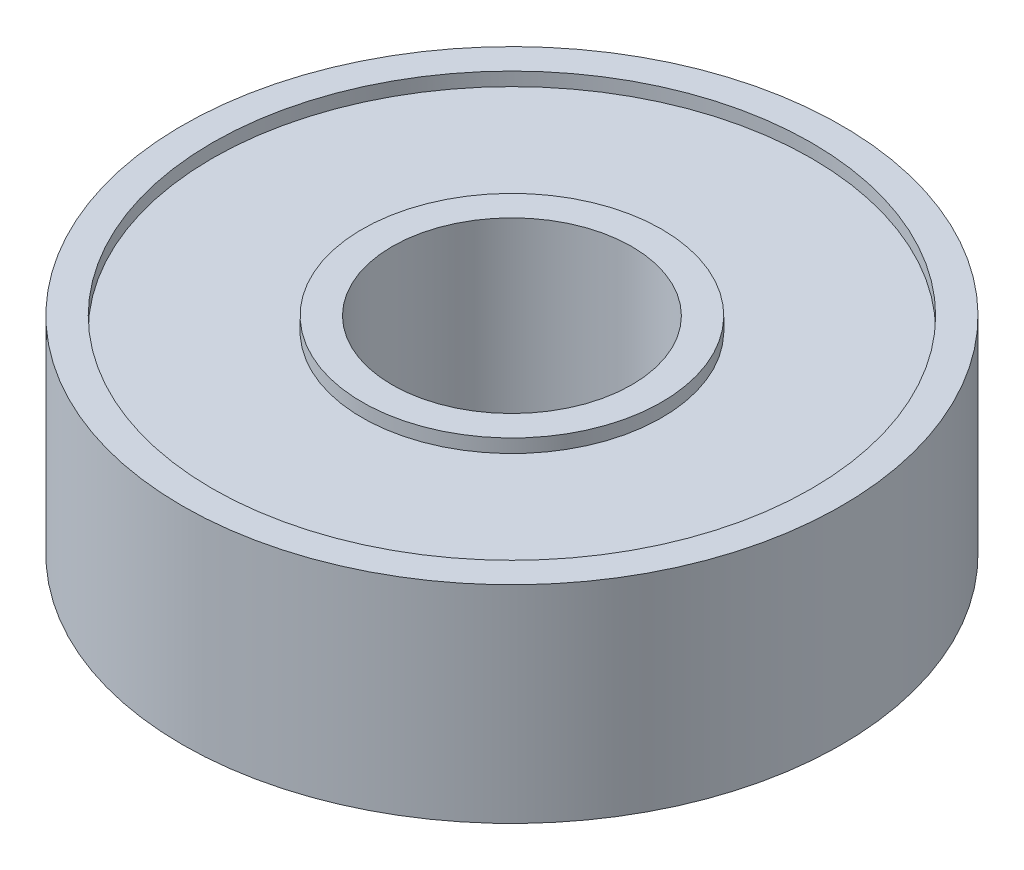
ISO-10303-21;
HEADER;
FILE_DESCRIPTION(('STEP AP214'),'2;1');
FILE_NAME('part.step','',(''),(''),'','','');
FILE_SCHEMA(('AUTOMOTIVE_DESIGN { 1 0 10303 214 1 1 1 1 }'));
ENDSEC;
DATA;
#1=APPLICATION_CONTEXT('core data for automotive mechanical design processes');
#2=APPLICATION_PROTOCOL_DEFINITION('international standard','automotive_design',2000,#1);
#3=PRODUCT_CONTEXT('',#1,'mechanical');
#4=PRODUCT('Part','Part','',(#3));
#5=PRODUCT_RELATED_PRODUCT_CATEGORY('part','',(#4));
#6=PRODUCT_DEFINITION_FORMATION('','',#4);
#7=PRODUCT_DEFINITION_CONTEXT('part definition',#1,'design');
#8=PRODUCT_DEFINITION('design','',#6,#7);
#9=PRODUCT_DEFINITION_SHAPE('','',#8);
#10=(LENGTH_UNIT() NAMED_UNIT(*) SI_UNIT(.MILLI.,.METRE.));
#11=(NAMED_UNIT(*) PLANE_ANGLE_UNIT() SI_UNIT($,.RADIAN.));
#12=(NAMED_UNIT(*) SI_UNIT($,.STERADIAN.) SOLID_ANGLE_UNIT());
#13=UNCERTAINTY_MEASURE_WITH_UNIT(LENGTH_MEASURE(1.E-05),#10,'distance_accuracy_value','');
#14=(GEOMETRIC_REPRESENTATION_CONTEXT(3) GLOBAL_UNCERTAINTY_ASSIGNED_CONTEXT((#13)) GLOBAL_UNIT_ASSIGNED_CONTEXT((#10,
#11,#12)) REPRESENTATION_CONTEXT('',''));
#15=CARTESIAN_POINT('',(0.,0.,0.));
#16=DIRECTION('',(0.,0.,1.));
#17=DIRECTION('',(1.,0.,0.));
#18=AXIS2_PLACEMENT_3D('',#15,#16,#17);
#19=CARTESIAN_POINT('',(0.,3.,0.));
#20=DIRECTION('',(0.,1.,0.));
#21=DIRECTION('',(0.,0.,1.));
#22=AXIS2_PLACEMENT_3D('',#19,#20,#21);
#23=PLANE('',#22);
#24=CARTESIAN_POINT('',(0.,3.,0.));
#25=DIRECTION('',(0.,1.,0.));
#26=DIRECTION('',(0.,0.,1.));
#27=AXIS2_PLACEMENT_3D('',#24,#25,#26);
#28=CIRCLE('',#27,10.);
#29=CARTESIAN_POINT('',(0.,3.,-10.));
#30=VERTEX_POINT('',#29);
#31=EDGE_CURVE('E40',#30,#30,#28,.F.);
#32=ORIENTED_EDGE('',*,*,#31,.F.);
#33=EDGE_LOOP('',(#32));
#34=FACE_BOUND('',#33,.T.);
#35=CARTESIAN_POINT('',(0.,3.,0.));
#36=DIRECTION('',(0.,1.,0.));
#37=DIRECTION('',(0.,0.,1.));
#38=AXIS2_PLACEMENT_3D('',#35,#36,#37);
#39=CIRCLE('',#38,5.);
#40=CARTESIAN_POINT('',(0.,3.,-5.));
#41=VERTEX_POINT('',#40);
#42=EDGE_CURVE('E60',#41,#41,#39,.F.);
#43=ORIENTED_EDGE('',*,*,#42,.T.);
#44=EDGE_LOOP('',(#43));
#45=FACE_BOUND('',#44,.T.);
#46=ADVANCED_FACE('F33',(#34,#45),#23,.T.);
#47=CARTESIAN_POINT('',(0.,-3.,0.));
#48=DIRECTION('',(0.,1.,0.));
#49=DIRECTION('',(0.,0.,1.));
#50=AXIS2_PLACEMENT_3D('',#47,#48,#49);
#51=PLANE('',#50);
#52=CARTESIAN_POINT('',(0.,-3.,0.));
#53=DIRECTION('',(0.,1.,0.));
#54=DIRECTION('',(0.,0.,1.));
#55=AXIS2_PLACEMENT_3D('',#52,#53,#54);
#56=CIRCLE('',#55,10.);
#57=CARTESIAN_POINT('',(0.,-3.,-10.));
#58=VERTEX_POINT('',#57);
#59=EDGE_CURVE('E44',#58,#58,#56,.F.);
#60=ORIENTED_EDGE('',*,*,#59,.T.);
#61=EDGE_LOOP('',(#60));
#62=FACE_BOUND('',#61,.T.);
#63=CARTESIAN_POINT('',(0.,-3.,0.));
#64=DIRECTION('',(0.,1.,0.));
#65=DIRECTION('',(0.,0.,1.));
#66=AXIS2_PLACEMENT_3D('',#63,#64,#65);
#67=CIRCLE('',#66,5.);
#68=CARTESIAN_POINT('',(0.,-3.,-5.));
#69=VERTEX_POINT('',#68);
#70=EDGE_CURVE('E10',#69,#69,#67,.F.);
#71=ORIENTED_EDGE('',*,*,#70,.F.);
#72=EDGE_LOOP('',(#71));
#73=FACE_BOUND('',#72,.T.);
#74=ADVANCED_FACE('F101',(#62,#73),#51,.F.);
#75=CARTESIAN_POINT('',(0.,3.45,0.));
#76=DIRECTION('',(0.,1.,0.));
#77=DIRECTION('',(0.,0.,1.));
#78=AXIS2_PLACEMENT_3D('',#75,#76,#77);
#79=PLANE('',#78);
#80=CARTESIAN_POINT('',(0.,3.45,0.));
#81=DIRECTION('',(0.,1.,0.));
#82=DIRECTION('',(0.,0.,1.));
#83=AXIS2_PLACEMENT_3D('',#80,#81,#82);
#84=CIRCLE('',#83,11.);
#85=CARTESIAN_POINT('',(0.,3.45,11.));
#86=VERTEX_POINT('',#85);
#87=EDGE_CURVE('E49',#86,#86,#84,.T.);
#88=ORIENTED_EDGE('',*,*,#87,.T.);
#89=EDGE_LOOP('',(#88));
#90=FACE_BOUND('',#89,.T.);
#91=CARTESIAN_POINT('',(0.,3.45,0.));
#92=DIRECTION('',(0.,1.,0.));
#93=DIRECTION('',(0.,0.,1.));
#94=AXIS2_PLACEMENT_3D('',#91,#92,#93);
#95=CIRCLE('',#94,10.);
#96=CARTESIAN_POINT('',(0.,3.45,-10.));
#97=VERTEX_POINT('',#96);
#98=EDGE_CURVE('E54',#97,#97,#95,.T.);
#99=ORIENTED_EDGE('',*,*,#98,.F.);
#100=EDGE_LOOP('',(#99));
#101=FACE_BOUND('',#100,.T.);
#102=ADVANCED_FACE('F107',(#90,#101),#79,.T.);
#103=CARTESIAN_POINT('',(0.,3.45,0.));
#104=DIRECTION('',(0.,-1.,0.));
#105=DIRECTION('',(0.,0.,-1.));
#106=AXIS2_PLACEMENT_3D('',#103,#104,#105);
#107=CYLINDRICAL_SURFACE('',#106,10.);
#108=CARTESIAN_POINT('',(0.,3.,-10.));
#109=CARTESIAN_POINT('',(0.,3.0046875,-10.));
#110=CARTESIAN_POINT('',(0.,3.009375,-10.));
#111=CARTESIAN_POINT('',(0.,3.01875,-10.));
#112=CARTESIAN_POINT('',(0.,3.0234375,-10.));
#113=CARTESIAN_POINT('',(0.,3.0328125,-10.));
#114=CARTESIAN_POINT('',(0.,3.0375,-10.));
#115=CARTESIAN_POINT('',(0.,3.046875,-10.));
#116=CARTESIAN_POINT('',(0.,3.0515625,-10.));
#117=CARTESIAN_POINT('',(0.,3.0609375,-10.));
#118=CARTESIAN_POINT('',(0.,3.065625,-10.));
#119=CARTESIAN_POINT('',(0.,3.075,-10.));
#120=CARTESIAN_POINT('',(0.,3.0796875,-10.));
#121=CARTESIAN_POINT('',(0.,3.0890625,-10.));
#122=CARTESIAN_POINT('',(0.,3.09375,-10.));
#123=CARTESIAN_POINT('',(0.,3.103125,-10.));
#124=CARTESIAN_POINT('',(0.,3.1078125,-10.));
#125=CARTESIAN_POINT('',(0.,3.1171875,-10.));
#126=CARTESIAN_POINT('',(0.,3.121875,-10.));
#127=CARTESIAN_POINT('',(0.,3.13125,-10.));
#128=CARTESIAN_POINT('',(0.,3.1359375,-10.));
#129=CARTESIAN_POINT('',(0.,3.1453125,-10.));
#130=CARTESIAN_POINT('',(0.,3.15,-10.));
#131=CARTESIAN_POINT('',(0.,3.159375,-10.));
#132=CARTESIAN_POINT('',(0.,3.1640625,-10.));
#133=CARTESIAN_POINT('',(0.,3.1734375,-10.));
#134=CARTESIAN_POINT('',(0.,3.178125,-10.));
#135=CARTESIAN_POINT('',(0.,3.1875,-10.));
#136=CARTESIAN_POINT('',(0.,3.1921875,-10.));
#137=CARTESIAN_POINT('',(0.,3.2015625,-10.));
#138=CARTESIAN_POINT('',(0.,3.20625,-10.));
#139=CARTESIAN_POINT('',(0.,3.215625,-10.));
#140=CARTESIAN_POINT('',(0.,3.2203125,-10.));
#141=CARTESIAN_POINT('',(0.,3.2296875,-10.));
#142=CARTESIAN_POINT('',(0.,3.234375,-10.));
#143=CARTESIAN_POINT('',(0.,3.24375,-10.));
#144=CARTESIAN_POINT('',(0.,3.2484375,-10.));
#145=CARTESIAN_POINT('',(0.,3.2578125,-10.));
#146=CARTESIAN_POINT('',(0.,3.2625,-10.));
#147=CARTESIAN_POINT('',(0.,3.271875,-10.));
#148=CARTESIAN_POINT('',(0.,3.2765625,-10.));
#149=CARTESIAN_POINT('',(0.,3.2859375,-10.));
#150=CARTESIAN_POINT('',(0.,3.290625,-10.));
#151=CARTESIAN_POINT('',(0.,3.3,-10.));
#152=CARTESIAN_POINT('',(0.,3.3046875,-10.));
#153=CARTESIAN_POINT('',(0.,3.3140625,-10.));
#154=CARTESIAN_POINT('',(0.,3.31875,-10.));
#155=CARTESIAN_POINT('',(0.,3.328125,-10.));
#156=CARTESIAN_POINT('',(0.,3.3328125,-10.));
#157=CARTESIAN_POINT('',(0.,3.3421875,-10.));
#158=CARTESIAN_POINT('',(0.,3.346875,-10.));
#159=CARTESIAN_POINT('',(0.,3.35625,-10.));
#160=CARTESIAN_POINT('',(0.,3.3609375,-10.));
#161=CARTESIAN_POINT('',(0.,3.3703125,-10.));
#162=CARTESIAN_POINT('',(0.,3.375,-10.));
#163=CARTESIAN_POINT('',(0.,3.384375,-10.));
#164=CARTESIAN_POINT('',(0.,3.3890625,-10.));
#165=CARTESIAN_POINT('',(0.,3.3984375,-10.));
#166=CARTESIAN_POINT('',(0.,3.403125,-10.));
#167=CARTESIAN_POINT('',(0.,3.4125,-10.));
#168=CARTESIAN_POINT('',(0.,3.4171875,-10.));
#169=CARTESIAN_POINT('',(0.,3.4265625,-10.));
#170=CARTESIAN_POINT('',(0.,3.43125,-10.));
#171=CARTESIAN_POINT('',(0.,3.440625,-10.));
#172=CARTESIAN_POINT('',(0.,3.4453125,-10.));
#173=CARTESIAN_POINT('',(0.,3.45,-10.));
#174=B_SPLINE_CURVE_WITH_KNOTS('',3,(#108,#109,#110,#111,#112,#113,#114,#115,#116,#117,#118,
#119,#120,#121,#122,#123,#124,#125,#126,#127,#128,#129,#130,#131,#132,#133,#134,#135,#136,#137,
#138,#139,#140,#141,#142,#143,#144,#145,#146,#147,#148,#149,#150,#151,#152,#153,#154,#155,#156,
#157,#158,#159,#160,#161,#162,#163,#164,#165,#166,#167,#168,#169,#170,#171,#172,#173),
.UNSPECIFIED.,.F.,.F.,(4,2,2,2,2,2,2,2,2,2,2,2,2,2,2,2,2,2,2,2,2,2,2,2,2,2,2,2,2,2,2,2,4),(0.,
0.0140625000000002,0.0281250000000004,0.0421875000000001,0.0562500000000003,0.0703125000000001,
0.0843750000000003,0.0984375000000004,0.1125,0.1265625,0.140625,0.1546875,0.168750000000001,
0.1828125,0.196875,0.2109375,0.225,0.239062500000001,0.253125,0.267187500000001,0.28125,
0.2953125,0.309375000000001,0.3234375,0.337500000000001,0.3515625,0.365625,0.379687500000001,
0.39375,0.407812500000001,0.421875,0.435937500000001,0.450000000000001),.UNSPECIFIED.);
#175=EDGE_CURVE('BSEAM117',#30,#97,#174,.T.);
#176=ORIENTED_EDGE('',*,*,#31,.T.);
#177=ORIENTED_EDGE('',*,*,#98,.T.);
#178=ORIENTED_EDGE('',*,*,#175,.T.);
#179=ORIENTED_EDGE('',*,*,#175,.F.);
#180=EDGE_LOOP('',(#176,#178,#177,#179));
#181=FACE_BOUND('',#180,.T.);
#182=ADVANCED_FACE('F117',(#181),#107,.F.);
#183=CARTESIAN_POINT('',(0.,3.,0.));
#184=DIRECTION('',(0.,-1.,0.));
#185=DIRECTION('',(0.,0.,-1.));
#186=AXIS2_PLACEMENT_3D('',#183,#184,#185);
#187=CYLINDRICAL_SURFACE('',#186,11.);
#188=CARTESIAN_POINT('',(0.,-3.45,0.));
#189=DIRECTION('',(0.,1.,0.));
#190=DIRECTION('',(0.,0.,1.));
#191=AXIS2_PLACEMENT_3D('',#188,#189,#190);
#192=CIRCLE('',#191,11.);
#193=CARTESIAN_POINT('',(0.,-3.45,11.));
#194=VERTEX_POINT('',#193);
#195=EDGE_CURVE('E51',#194,#194,#192,.T.);
#196=ORIENTED_EDGE('',*,*,#195,.T.);
#197=EDGE_LOOP('',(#196));
#198=FACE_BOUND('',#197,.T.);
#199=ORIENTED_EDGE('',*,*,#87,.F.);
#200=EDGE_LOOP('',(#199));
#201=FACE_BOUND('',#200,.T.);
#202=ADVANCED_FACE('F35',(#198,#201),#187,.T.);
#203=CARTESIAN_POINT('',(0.,-3.45,0.));
#204=DIRECTION('',(0.,1.,0.));
#205=DIRECTION('',(0.,0.,1.));
#206=AXIS2_PLACEMENT_3D('',#203,#204,#205);
#207=PLANE('',#206);
#208=ORIENTED_EDGE('',*,*,#195,.F.);
#209=EDGE_LOOP('',(#208));
#210=FACE_BOUND('',#209,.T.);
#211=CARTESIAN_POINT('',(0.,-3.45,0.));
#212=DIRECTION('',(0.,1.,0.));
#213=DIRECTION('',(0.,0.,1.));
#214=AXIS2_PLACEMENT_3D('',#211,#212,#213);
#215=CIRCLE('',#214,10.);
#216=CARTESIAN_POINT('',(0.,-3.45,-10.));
#217=VERTEX_POINT('',#216);
#218=EDGE_CURVE('E57',#217,#217,#215,.T.);
#219=ORIENTED_EDGE('',*,*,#218,.T.);
#220=EDGE_LOOP('',(#219));
#221=FACE_BOUND('',#220,.T.);
#222=ADVANCED_FACE('F111',(#210,#221),#207,.F.);
#223=CARTESIAN_POINT('',(0.,-3.45,-10.));
#224=CARTESIAN_POINT('',(0.,-3.4453125,-10.));
#225=CARTESIAN_POINT('',(0.,-3.440625,-10.));
#226=CARTESIAN_POINT('',(0.,-3.43125,-10.));
#227=CARTESIAN_POINT('',(0.,-3.4265625,-10.));
#228=CARTESIAN_POINT('',(0.,-3.4171875,-10.));
#229=CARTESIAN_POINT('',(0.,-3.4125,-10.));
#230=CARTESIAN_POINT('',(0.,-3.403125,-10.));
#231=CARTESIAN_POINT('',(0.,-3.3984375,-10.));
#232=CARTESIAN_POINT('',(0.,-3.3890625,-10.));
#233=CARTESIAN_POINT('',(0.,-3.384375,-10.));
#234=CARTESIAN_POINT('',(0.,-3.375,-10.));
#235=CARTESIAN_POINT('',(0.,-3.3703125,-10.));
#236=CARTESIAN_POINT('',(0.,-3.3609375,-10.));
#237=CARTESIAN_POINT('',(0.,-3.35625,-10.));
#238=CARTESIAN_POINT('',(0.,-3.346875,-10.));
#239=CARTESIAN_POINT('',(0.,-3.3421875,-10.));
#240=CARTESIAN_POINT('',(0.,-3.3328125,-10.));
#241=CARTESIAN_POINT('',(0.,-3.328125,-10.));
#242=CARTESIAN_POINT('',(0.,-3.31875,-10.));
#243=CARTESIAN_POINT('',(0.,-3.3140625,-10.));
#244=CARTESIAN_POINT('',(0.,-3.3046875,-10.));
#245=CARTESIAN_POINT('',(0.,-3.3,-10.));
#246=CARTESIAN_POINT('',(0.,-3.290625,-10.));
#247=CARTESIAN_POINT('',(0.,-3.2859375,-10.));
#248=CARTESIAN_POINT('',(0.,-3.2765625,-10.));
#249=CARTESIAN_POINT('',(0.,-3.271875,-10.));
#250=CARTESIAN_POINT('',(0.,-3.2625,-10.));
#251=CARTESIAN_POINT('',(0.,-3.2578125,-10.));
#252=CARTESIAN_POINT('',(0.,-3.2484375,-10.));
#253=CARTESIAN_POINT('',(0.,-3.24375,-10.));
#254=CARTESIAN_POINT('',(0.,-3.234375,-10.));
#255=CARTESIAN_POINT('',(0.,-3.2296875,-10.));
#256=CARTESIAN_POINT('',(0.,-3.2203125,-10.));
#257=CARTESIAN_POINT('',(0.,-3.215625,-10.));
#258=CARTESIAN_POINT('',(0.,-3.20625,-10.));
#259=CARTESIAN_POINT('',(0.,-3.2015625,-10.));
#260=CARTESIAN_POINT('',(0.,-3.1921875,-10.));
#261=CARTESIAN_POINT('',(0.,-3.1875,-10.));
#262=CARTESIAN_POINT('',(0.,-3.178125,-10.));
#263=CARTESIAN_POINT('',(0.,-3.1734375,-10.));
#264=CARTESIAN_POINT('',(0.,-3.1640625,-10.));
#265=CARTESIAN_POINT('',(0.,-3.159375,-10.));
#266=CARTESIAN_POINT('',(0.,-3.15,-10.));
#267=CARTESIAN_POINT('',(0.,-3.1453125,-10.));
#268=CARTESIAN_POINT('',(0.,-3.1359375,-10.));
#269=CARTESIAN_POINT('',(0.,-3.13125,-10.));
#270=CARTESIAN_POINT('',(0.,-3.121875,-10.));
#271=CARTESIAN_POINT('',(0.,-3.1171875,-10.));
#272=CARTESIAN_POINT('',(0.,-3.1078125,-10.));
#273=CARTESIAN_POINT('',(0.,-3.103125,-10.));
#274=CARTESIAN_POINT('',(0.,-3.09375,-10.));
#275=CARTESIAN_POINT('',(0.,-3.0890625,-10.));
#276=CARTESIAN_POINT('',(0.,-3.0796875,-10.));
#277=CARTESIAN_POINT('',(0.,-3.075,-10.));
#278=CARTESIAN_POINT('',(0.,-3.065625,-10.));
#279=CARTESIAN_POINT('',(0.,-3.0609375,-10.));
#280=CARTESIAN_POINT('',(0.,-3.0515625,-10.));
#281=CARTESIAN_POINT('',(0.,-3.046875,-10.));
#282=CARTESIAN_POINT('',(0.,-3.0375,-10.));
#283=CARTESIAN_POINT('',(0.,-3.0328125,-10.));
#284=CARTESIAN_POINT('',(0.,-3.0234375,-10.));
#285=CARTESIAN_POINT('',(0.,-3.01875,-10.));
#286=CARTESIAN_POINT('',(0.,-3.009375,-10.));
#287=CARTESIAN_POINT('',(0.,-3.0046875,-10.));
#288=CARTESIAN_POINT('',(0.,-3.,-10.));
#289=B_SPLINE_CURVE_WITH_KNOTS('',3,(#223,#224,#225,#226,#227,#228,#229,#230,#231,#232,#233,
#234,#235,#236,#237,#238,#239,#240,#241,#242,#243,#244,#245,#246,#247,#248,#249,#250,#251,#252,
#253,#254,#255,#256,#257,#258,#259,#260,#261,#262,#263,#264,#265,#266,#267,#268,#269,#270,#271,
#272,#273,#274,#275,#276,#277,#278,#279,#280,#281,#282,#283,#284,#285,#286,#287,#288),
.UNSPECIFIED.,.F.,.F.,(4,2,2,2,2,2,2,2,2,2,2,2,2,2,2,2,2,2,2,2,2,2,2,2,2,2,2,2,2,2,2,2,4),(0.,
0.0140625000000002,0.0281250000000004,0.0421874999999997,0.0562499999999999,0.0703125000000001,
0.0843749999999994,0.0984374999999996,0.1125,0.1265625,0.140625,0.154687499999999,0.16875,
0.1828125,0.196874999999999,0.210937499999999,0.225,0.2390625,0.253125,0.267187499999999,
0.281249999999999,0.2953125,0.309374999999999,0.323437499999999,0.337499999999999,
0.351562499999999,0.365625,0.379687499999999,0.393749999999999,0.407812499999999,
0.421874999999999,0.435937499999999,0.449999999999999),.UNSPECIFIED.);
#290=EDGE_CURVE('BSEAM114',#217,#58,#289,.T.);
#291=ORIENTED_EDGE('',*,*,#218,.F.);
#292=ORIENTED_EDGE('',*,*,#59,.F.);
#293=ORIENTED_EDGE('',*,*,#290,.T.);
#294=ORIENTED_EDGE('',*,*,#290,.F.);
#295=EDGE_LOOP('',(#291,#293,#292,#294));
#296=FACE_BOUND('',#295,.T.);
#297=ADVANCED_FACE('F114',(#296),#107,.F.);
#298=CARTESIAN_POINT('',(0.,-3.45,0.));
#299=DIRECTION('',(0.,1.,0.));
#300=DIRECTION('',(0.,0.,1.));
#301=AXIS2_PLACEMENT_3D('',#298,#299,#300);
#302=PLANE('',#301);
#303=CARTESIAN_POINT('',(0.,-3.45,0.));
#304=DIRECTION('',(0.,1.,0.));
#305=DIRECTION('',(0.,0.,1.));
#306=AXIS2_PLACEMENT_3D('',#303,#304,#305);
#307=CIRCLE('',#306,4.);
#308=CARTESIAN_POINT('',(0.,-3.45,4.));
#309=VERTEX_POINT('',#308);
#310=EDGE_CURVE('E69',#309,#309,#307,.T.);
#311=ORIENTED_EDGE('',*,*,#310,.T.);
#312=EDGE_LOOP('',(#311));
#313=FACE_BOUND('',#312,.T.);
#314=CARTESIAN_POINT('',(0.,-3.45,0.));
#315=DIRECTION('',(0.,1.,0.));
#316=DIRECTION('',(0.,0.,1.));
#317=AXIS2_PLACEMENT_3D('',#314,#315,#316);
#318=CIRCLE('',#317,5.);
#319=CARTESIAN_POINT('',(0.,-3.45,-5.));
#320=VERTEX_POINT('',#319);
#321=EDGE_CURVE('E66',#320,#320,#318,.T.);
#322=ORIENTED_EDGE('',*,*,#321,.F.);
#323=EDGE_LOOP('',(#322));
#324=FACE_BOUND('',#323,.T.);
#325=ADVANCED_FACE('F95',(#313,#324),#302,.F.);
#326=CARTESIAN_POINT('',(0.,3.45,0.));
#327=DIRECTION('',(0.,-1.,0.));
#328=DIRECTION('',(0.,0.,-1.));
#329=AXIS2_PLACEMENT_3D('',#326,#327,#328);
#330=CYLINDRICAL_SURFACE('',#329,5.);
#331=CARTESIAN_POINT('',(0.,-3.45,-5.));
#332=CARTESIAN_POINT('',(0.,-3.4453125,-5.));
#333=CARTESIAN_POINT('',(0.,-3.440625,-5.));
#334=CARTESIAN_POINT('',(0.,-3.43125,-5.));
#335=CARTESIAN_POINT('',(0.,-3.4265625,-5.));
#336=CARTESIAN_POINT('',(0.,-3.4171875,-5.));
#337=CARTESIAN_POINT('',(0.,-3.4125,-5.));
#338=CARTESIAN_POINT('',(0.,-3.403125,-5.));
#339=CARTESIAN_POINT('',(0.,-3.3984375,-5.));
#340=CARTESIAN_POINT('',(0.,-3.3890625,-5.));
#341=CARTESIAN_POINT('',(0.,-3.384375,-5.));
#342=CARTESIAN_POINT('',(0.,-3.375,-5.));
#343=CARTESIAN_POINT('',(0.,-3.3703125,-5.));
#344=CARTESIAN_POINT('',(0.,-3.3609375,-5.));
#345=CARTESIAN_POINT('',(0.,-3.35625,-5.));
#346=CARTESIAN_POINT('',(0.,-3.346875,-5.));
#347=CARTESIAN_POINT('',(0.,-3.3421875,-5.));
#348=CARTESIAN_POINT('',(0.,-3.3328125,-5.));
#349=CARTESIAN_POINT('',(0.,-3.328125,-5.));
#350=CARTESIAN_POINT('',(0.,-3.31875,-5.));
#351=CARTESIAN_POINT('',(0.,-3.3140625,-5.));
#352=CARTESIAN_POINT('',(0.,-3.3046875,-5.));
#353=CARTESIAN_POINT('',(0.,-3.3,-5.));
#354=CARTESIAN_POINT('',(0.,-3.290625,-5.));
#355=CARTESIAN_POINT('',(0.,-3.2859375,-5.));
#356=CARTESIAN_POINT('',(0.,-3.2765625,-5.));
#357=CARTESIAN_POINT('',(0.,-3.271875,-5.));
#358=CARTESIAN_POINT('',(0.,-3.2625,-5.));
#359=CARTESIAN_POINT('',(0.,-3.2578125,-5.));
#360=CARTESIAN_POINT('',(0.,-3.2484375,-5.));
#361=CARTESIAN_POINT('',(0.,-3.24375,-5.));
#362=CARTESIAN_POINT('',(0.,-3.234375,-5.));
#363=CARTESIAN_POINT('',(0.,-3.2296875,-5.));
#364=CARTESIAN_POINT('',(0.,-3.2203125,-5.));
#365=CARTESIAN_POINT('',(0.,-3.215625,-5.));
#366=CARTESIAN_POINT('',(0.,-3.20625,-5.));
#367=CARTESIAN_POINT('',(0.,-3.2015625,-5.));
#368=CARTESIAN_POINT('',(0.,-3.1921875,-5.));
#369=CARTESIAN_POINT('',(0.,-3.1875,-5.));
#370=CARTESIAN_POINT('',(0.,-3.178125,-5.));
#371=CARTESIAN_POINT('',(0.,-3.1734375,-5.));
#372=CARTESIAN_POINT('',(0.,-3.1640625,-5.));
#373=CARTESIAN_POINT('',(0.,-3.159375,-5.));
#374=CARTESIAN_POINT('',(0.,-3.15,-5.));
#375=CARTESIAN_POINT('',(0.,-3.1453125,-5.));
#376=CARTESIAN_POINT('',(0.,-3.1359375,-5.));
#377=CARTESIAN_POINT('',(0.,-3.13125,-5.));
#378=CARTESIAN_POINT('',(0.,-3.121875,-5.));
#379=CARTESIAN_POINT('',(0.,-3.1171875,-5.));
#380=CARTESIAN_POINT('',(0.,-3.1078125,-5.));
#381=CARTESIAN_POINT('',(0.,-3.103125,-5.));
#382=CARTESIAN_POINT('',(0.,-3.09375,-5.));
#383=CARTESIAN_POINT('',(0.,-3.0890625,-5.));
#384=CARTESIAN_POINT('',(0.,-3.0796875,-5.));
#385=CARTESIAN_POINT('',(0.,-3.075,-5.));
#386=CARTESIAN_POINT('',(0.,-3.065625,-5.));
#387=CARTESIAN_POINT('',(0.,-3.0609375,-5.));
#388=CARTESIAN_POINT('',(0.,-3.0515625,-5.));
#389=CARTESIAN_POINT('',(0.,-3.046875,-5.));
#390=CARTESIAN_POINT('',(0.,-3.0375,-5.));
#391=CARTESIAN_POINT('',(0.,-3.0328125,-5.));
#392=CARTESIAN_POINT('',(0.,-3.0234375,-5.));
#393=CARTESIAN_POINT('',(0.,-3.01875,-5.));
#394=CARTESIAN_POINT('',(0.,-3.009375,-5.));
#395=CARTESIAN_POINT('',(0.,-3.0046875,-5.));
#396=CARTESIAN_POINT('',(0.,-3.,-5.));
#397=B_SPLINE_CURVE_WITH_KNOTS('',3,(#331,#332,#333,#334,#335,#336,#337,#338,#339,#340,#341,
#342,#343,#344,#345,#346,#347,#348,#349,#350,#351,#352,#353,#354,#355,#356,#357,#358,#359,#360,
#361,#362,#363,#364,#365,#366,#367,#368,#369,#370,#371,#372,#373,#374,#375,#376,#377,#378,#379,
#380,#381,#382,#383,#384,#385,#386,#387,#388,#389,#390,#391,#392,#393,#394,#395,#396),
.UNSPECIFIED.,.F.,.F.,(4,2,2,2,2,2,2,2,2,2,2,2,2,2,2,2,2,2,2,2,2,2,2,2,2,2,2,2,2,2,2,2,4),(0.,
0.0140625000000002,0.0281250000000004,0.0421874999999997,0.0562499999999999,0.0703125000000001,
0.0843749999999994,0.0984374999999996,0.1125,0.1265625,0.140625,0.154687499999999,0.16875,
0.1828125,0.196874999999999,0.210937499999999,0.225,0.2390625,0.253125,0.267187499999999,
0.281249999999999,0.2953125,0.309374999999999,0.323437499999999,0.337499999999999,
0.351562499999999,0.365625,0.379687499999999,0.393749999999999,0.407812499999999,
0.421874999999999,0.435937499999999,0.449999999999999),.UNSPECIFIED.);
#398=EDGE_CURVE('BSEAM89',#320,#69,#397,.T.);
#399=ORIENTED_EDGE('',*,*,#321,.T.);
#400=ORIENTED_EDGE('',*,*,#70,.T.);
#401=ORIENTED_EDGE('',*,*,#398,.T.);
#402=ORIENTED_EDGE('',*,*,#398,.F.);
#403=EDGE_LOOP('',(#399,#401,#400,#402));
#404=FACE_BOUND('',#403,.T.);
#405=ADVANCED_FACE('F89',(#404),#330,.T.);
#406=CARTESIAN_POINT('',(0.,3.45,0.));
#407=DIRECTION('',(0.,1.,0.));
#408=DIRECTION('',(0.,0.,1.));
#409=AXIS2_PLACEMENT_3D('',#406,#407,#408);
#410=CIRCLE('',#409,5.);
#411=CARTESIAN_POINT('',(0.,3.45,-5.));
#412=VERTEX_POINT('',#411);
#413=EDGE_CURVE('E65',#412,#412,#410,.T.);
#414=CARTESIAN_POINT('',(0.,3.,-5.));
#415=CARTESIAN_POINT('',(0.,3.0046875,-5.));
#416=CARTESIAN_POINT('',(0.,3.009375,-5.));
#417=CARTESIAN_POINT('',(0.,3.01875,-5.));
#418=CARTESIAN_POINT('',(0.,3.0234375,-5.));
#419=CARTESIAN_POINT('',(0.,3.0328125,-5.));
#420=CARTESIAN_POINT('',(0.,3.0375,-5.));
#421=CARTESIAN_POINT('',(0.,3.046875,-5.));
#422=CARTESIAN_POINT('',(0.,3.0515625,-5.));
#423=CARTESIAN_POINT('',(0.,3.0609375,-5.));
#424=CARTESIAN_POINT('',(0.,3.065625,-5.));
#425=CARTESIAN_POINT('',(0.,3.075,-5.));
#426=CARTESIAN_POINT('',(0.,3.0796875,-5.));
#427=CARTESIAN_POINT('',(0.,3.0890625,-5.));
#428=CARTESIAN_POINT('',(0.,3.09375,-5.));
#429=CARTESIAN_POINT('',(0.,3.103125,-5.));
#430=CARTESIAN_POINT('',(0.,3.1078125,-5.));
#431=CARTESIAN_POINT('',(0.,3.1171875,-5.));
#432=CARTESIAN_POINT('',(0.,3.121875,-5.));
#433=CARTESIAN_POINT('',(0.,3.13125,-5.));
#434=CARTESIAN_POINT('',(0.,3.1359375,-5.));
#435=CARTESIAN_POINT('',(0.,3.1453125,-5.));
#436=CARTESIAN_POINT('',(0.,3.15,-5.));
#437=CARTESIAN_POINT('',(0.,3.159375,-5.));
#438=CARTESIAN_POINT('',(0.,3.1640625,-5.));
#439=CARTESIAN_POINT('',(0.,3.1734375,-5.));
#440=CARTESIAN_POINT('',(0.,3.178125,-5.));
#441=CARTESIAN_POINT('',(0.,3.1875,-5.));
#442=CARTESIAN_POINT('',(0.,3.1921875,-5.));
#443=CARTESIAN_POINT('',(0.,3.2015625,-5.));
#444=CARTESIAN_POINT('',(0.,3.20625,-5.));
#445=CARTESIAN_POINT('',(0.,3.215625,-5.));
#446=CARTESIAN_POINT('',(0.,3.2203125,-5.));
#447=CARTESIAN_POINT('',(0.,3.2296875,-5.));
#448=CARTESIAN_POINT('',(0.,3.234375,-5.));
#449=CARTESIAN_POINT('',(0.,3.24375,-5.));
#450=CARTESIAN_POINT('',(0.,3.2484375,-5.));
#451=CARTESIAN_POINT('',(0.,3.2578125,-5.));
#452=CARTESIAN_POINT('',(0.,3.2625,-5.));
#453=CARTESIAN_POINT('',(0.,3.271875,-5.));
#454=CARTESIAN_POINT('',(0.,3.2765625,-5.));
#455=CARTESIAN_POINT('',(0.,3.2859375,-5.));
#456=CARTESIAN_POINT('',(0.,3.290625,-5.));
#457=CARTESIAN_POINT('',(0.,3.3,-5.));
#458=CARTESIAN_POINT('',(0.,3.3046875,-5.));
#459=CARTESIAN_POINT('',(0.,3.3140625,-5.));
#460=CARTESIAN_POINT('',(0.,3.31875,-5.));
#461=CARTESIAN_POINT('',(0.,3.328125,-5.));
#462=CARTESIAN_POINT('',(0.,3.3328125,-5.));
#463=CARTESIAN_POINT('',(0.,3.3421875,-5.));
#464=CARTESIAN_POINT('',(0.,3.346875,-5.));
#465=CARTESIAN_POINT('',(0.,3.35625,-5.));
#466=CARTESIAN_POINT('',(0.,3.3609375,-5.));
#467=CARTESIAN_POINT('',(0.,3.3703125,-5.));
#468=CARTESIAN_POINT('',(0.,3.375,-5.));
#469=CARTESIAN_POINT('',(0.,3.384375,-5.));
#470=CARTESIAN_POINT('',(0.,3.3890625,-5.));
#471=CARTESIAN_POINT('',(0.,3.3984375,-5.));
#472=CARTESIAN_POINT('',(0.,3.403125,-5.));
#473=CARTESIAN_POINT('',(0.,3.4125,-5.));
#474=CARTESIAN_POINT('',(0.,3.4171875,-5.));
#475=CARTESIAN_POINT('',(0.,3.4265625,-5.));
#476=CARTESIAN_POINT('',(0.,3.43125,-5.));
#477=CARTESIAN_POINT('',(0.,3.440625,-5.));
#478=CARTESIAN_POINT('',(0.,3.4453125,-5.));
#479=CARTESIAN_POINT('',(0.,3.45,-5.));
#480=B_SPLINE_CURVE_WITH_KNOTS('',3,(#414,#415,#416,#417,#418,#419,#420,#421,#422,#423,#424,
#425,#426,#427,#428,#429,#430,#431,#432,#433,#434,#435,#436,#437,#438,#439,#440,#441,#442,#443,
#444,#445,#446,#447,#448,#449,#450,#451,#452,#453,#454,#455,#456,#457,#458,#459,#460,#461,#462,
#463,#464,#465,#466,#467,#468,#469,#470,#471,#472,#473,#474,#475,#476,#477,#478,#479),
.UNSPECIFIED.,.F.,.F.,(4,2,2,2,2,2,2,2,2,2,2,2,2,2,2,2,2,2,2,2,2,2,2,2,2,2,2,2,2,2,2,2,4),(0.,
0.0140625000000002,0.0281250000000004,0.0421875000000001,0.0562500000000003,0.0703125000000001,
0.0843750000000003,0.0984375000000004,0.1125,0.1265625,0.140625,0.1546875,0.168750000000001,
0.1828125,0.196875,0.2109375,0.225,0.239062500000001,0.253125,0.267187500000001,0.28125,
0.2953125,0.309375000000001,0.3234375,0.337500000000001,0.3515625,0.365625,0.379687500000001,
0.39375,0.407812500000001,0.421875,0.435937500000001,0.450000000000001),.UNSPECIFIED.);
#481=EDGE_CURVE('BSEAM84',#41,#412,#480,.T.);
#482=ORIENTED_EDGE('',*,*,#42,.F.);
#483=ORIENTED_EDGE('',*,*,#413,.F.);
#484=ORIENTED_EDGE('',*,*,#481,.T.);
#485=ORIENTED_EDGE('',*,*,#481,.F.);
#486=EDGE_LOOP('',(#482,#484,#483,#485));
#487=FACE_BOUND('',#486,.T.);
#488=ADVANCED_FACE('F84',(#487),#330,.T.);
#489=CARTESIAN_POINT('',(0.,3.45,0.));
#490=DIRECTION('',(0.,1.,0.));
#491=DIRECTION('',(0.,0.,1.));
#492=AXIS2_PLACEMENT_3D('',#489,#490,#491);
#493=PLANE('',#492);
#494=CARTESIAN_POINT('',(0.,3.45,0.));
#495=DIRECTION('',(0.,1.,0.));
#496=DIRECTION('',(0.,0.,1.));
#497=AXIS2_PLACEMENT_3D('',#494,#495,#496);
#498=CIRCLE('',#497,4.);
#499=CARTESIAN_POINT('',(0.,3.45,4.));
#500=VERTEX_POINT('',#499);
#501=EDGE_CURVE('E74',#500,#500,#498,.T.);
#502=ORIENTED_EDGE('',*,*,#501,.F.);
#503=EDGE_LOOP('',(#502));
#504=FACE_BOUND('',#503,.T.);
#505=ORIENTED_EDGE('',*,*,#413,.T.);
#506=EDGE_LOOP('',(#505));
#507=FACE_BOUND('',#506,.T.);
#508=ADVANCED_FACE('F81',(#504,#507),#493,.T.);
#509=CARTESIAN_POINT('',(0.,-6.55,0.));
#510=DIRECTION('',(0.,1.,0.));
#511=DIRECTION('',(0.,0.,1.));
#512=AXIS2_PLACEMENT_3D('',#509,#510,#511);
#513=CYLINDRICAL_SURFACE('',#512,4.);
#514=ORIENTED_EDGE('',*,*,#501,.T.);
#515=EDGE_LOOP('',(#514));
#516=FACE_BOUND('',#515,.T.);
#517=ORIENTED_EDGE('',*,*,#310,.F.);
#518=EDGE_LOOP('',(#517));
#519=FACE_BOUND('',#518,.T.);
#520=ADVANCED_FACE('F78',(#516,#519),#513,.F.);
#521=CLOSED_SHELL('',(#46,#74,#102,#182,#202,#222,#297,#325,#405,#488,#508,#520));
#522=MANIFOLD_SOLID_BREP('B2',#521);
#523=ADVANCED_BREP_SHAPE_REPRESENTATION('',(#18,#522),#14);
#524=SHAPE_DEFINITION_REPRESENTATION(#9,#523);
ENDSEC;
END-ISO-10303-21;
